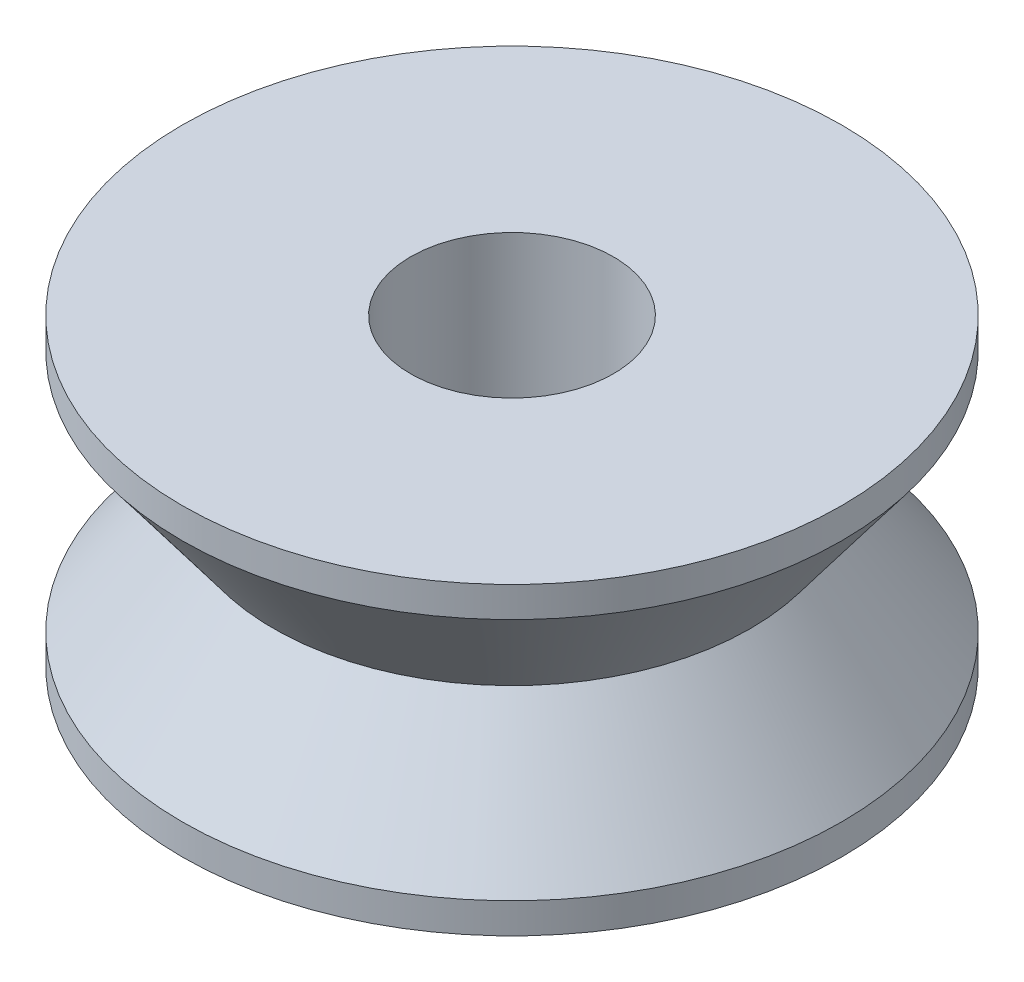
ISO-10303-21;
HEADER;
FILE_DESCRIPTION(('STEP AP214'),'2;1');
FILE_NAME('part.step','',(''),(''),'','','');
FILE_SCHEMA(('AUTOMOTIVE_DESIGN { 1 0 10303 214 1 1 1 1 }'));
ENDSEC;
DATA;
#1=APPLICATION_CONTEXT('core data for automotive mechanical design processes');
#2=APPLICATION_PROTOCOL_DEFINITION('international standard','automotive_design',2000,#1);
#3=PRODUCT_CONTEXT('',#1,'mechanical');
#4=PRODUCT('Part','Part','',(#3));
#5=PRODUCT_RELATED_PRODUCT_CATEGORY('part','',(#4));
#6=PRODUCT_DEFINITION_FORMATION('','',#4);
#7=PRODUCT_DEFINITION_CONTEXT('part definition',#1,'design');
#8=PRODUCT_DEFINITION('design','',#6,#7);
#9=PRODUCT_DEFINITION_SHAPE('','',#8);
#10=(LENGTH_UNIT() NAMED_UNIT(*) SI_UNIT(.MILLI.,.METRE.));
#11=(NAMED_UNIT(*) PLANE_ANGLE_UNIT() SI_UNIT($,.RADIAN.));
#12=(NAMED_UNIT(*) SI_UNIT($,.STERADIAN.) SOLID_ANGLE_UNIT());
#13=UNCERTAINTY_MEASURE_WITH_UNIT(LENGTH_MEASURE(1.E-05),#10,'distance_accuracy_value','');
#14=(GEOMETRIC_REPRESENTATION_CONTEXT(3) GLOBAL_UNCERTAINTY_ASSIGNED_CONTEXT((#13)) GLOBAL_UNIT_ASSIGNED_CONTEXT((#10,
#11,#12)) REPRESENTATION_CONTEXT('',''));
#15=CARTESIAN_POINT('',(0.,0.,0.));
#16=DIRECTION('',(0.,0.,1.));
#17=DIRECTION('',(1.,0.,0.));
#18=AXIS2_PLACEMENT_3D('',#15,#16,#17);
#19=CARTESIAN_POINT('',(0.,0.,0.));
#20=DIRECTION('',(0.,-1.,0.));
#21=DIRECTION('',(1.,0.,0.));
#22=AXIS2_PLACEMENT_3D('',#19,#20,#21);
#23=CONICAL_SURFACE('',#22,4.7,0.643501108793284);
#24=CARTESIAN_POINT('',(0.,-2.4,0.));
#25=DIRECTION('',(0.,-1.,0.));
#26=DIRECTION('',(1.,0.,0.));
#27=AXIS2_PLACEMENT_3D('',#24,#25,#26);
#28=CIRCLE('',#27,6.5);
#29=CARTESIAN_POINT('',(6.5,-2.4,0.));
#30=VERTEX_POINT('',#29);
#31=EDGE_CURVE('E52',#30,#30,#28,.T.);
#32=ORIENTED_EDGE('',*,*,#31,.F.);
#33=EDGE_LOOP('',(#32));
#34=FACE_BOUND('',#33,.T.);
#35=CARTESIAN_POINT('',(0.,0.,0.));
#36=DIRECTION('',(0.,-1.,0.));
#37=DIRECTION('',(1.,0.,0.));
#38=AXIS2_PLACEMENT_3D('',#35,#36,#37);
#39=CIRCLE('',#38,4.7);
#40=CARTESIAN_POINT('',(4.7,0.,0.));
#41=VERTEX_POINT('',#40);
#42=EDGE_CURVE('E10',#41,#41,#39,.T.);
#43=ORIENTED_EDGE('',*,*,#42,.T.);
#44=EDGE_LOOP('',(#43));
#45=FACE_BOUND('',#44,.T.);
#46=ADVANCED_FACE('F33',(#34,#45),#23,.T.);
#47=CARTESIAN_POINT('',(0.,2.4,0.));
#48=DIRECTION('',(0.,1.,0.));
#49=DIRECTION('',(-1.,0.,0.));
#50=AXIS2_PLACEMENT_3D('',#47,#48,#49);
#51=CONICAL_SURFACE('',#50,6.5,0.643501108793284);
#52=ORIENTED_EDGE('',*,*,#42,.F.);
#53=EDGE_LOOP('',(#52));
#54=FACE_BOUND('',#53,.T.);
#55=CARTESIAN_POINT('',(0.,2.4,0.));
#56=DIRECTION('',(0.,-1.,0.));
#57=DIRECTION('',(1.,0.,0.));
#58=AXIS2_PLACEMENT_3D('',#55,#56,#57);
#59=CIRCLE('',#58,6.5);
#60=CARTESIAN_POINT('',(6.5,2.4,0.));
#61=VERTEX_POINT('',#60);
#62=EDGE_CURVE('E40',#61,#61,#59,.T.);
#63=ORIENTED_EDGE('',*,*,#62,.T.);
#64=EDGE_LOOP('',(#63));
#65=FACE_BOUND('',#64,.T.);
#66=ADVANCED_FACE('F80',(#54,#65),#51,.T.);
#67=CARTESIAN_POINT('',(0.,-3.,0.));
#68=DIRECTION('',(0.,-1.,0.));
#69=DIRECTION('',(1.,0.,0.));
#70=AXIS2_PLACEMENT_3D('',#67,#68,#69);
#71=CYLINDRICAL_SURFACE('',#70,6.5);
#72=ORIENTED_EDGE('',*,*,#62,.F.);
#73=EDGE_LOOP('',(#72));
#74=FACE_BOUND('',#73,.T.);
#75=CARTESIAN_POINT('',(0.,3.,0.));
#76=DIRECTION('',(0.,-1.,0.));
#77=DIRECTION('',(1.,0.,0.));
#78=AXIS2_PLACEMENT_3D('',#75,#76,#77);
#79=CIRCLE('',#78,6.5);
#80=CARTESIAN_POINT('',(6.5,3.,0.));
#81=VERTEX_POINT('',#80);
#82=EDGE_CURVE('E44',#81,#81,#79,.T.);
#83=ORIENTED_EDGE('',*,*,#82,.T.);
#84=EDGE_LOOP('',(#83));
#85=FACE_BOUND('',#84,.T.);
#86=ADVANCED_FACE('F85',(#74,#85),#71,.T.);
#87=CARTESIAN_POINT('',(0.,3.,0.));
#88=DIRECTION('',(0.,-1.,0.));
#89=DIRECTION('',(1.,0.,0.));
#90=AXIS2_PLACEMENT_3D('',#87,#88,#89);
#91=PLANE('',#90);
#92=CARTESIAN_POINT('',(0.,3.,0.));
#93=DIRECTION('',(0.,1.,0.));
#94=DIRECTION('',(-1.,0.,0.));
#95=AXIS2_PLACEMENT_3D('',#92,#93,#94);
#96=CIRCLE('',#95,2.);
#97=CARTESIAN_POINT('',(-2.,3.,0.));
#98=VERTEX_POINT('',#97);
#99=EDGE_CURVE('E55',#98,#98,#96,.T.);
#100=ORIENTED_EDGE('',*,*,#99,.F.);
#101=EDGE_LOOP('',(#100));
#102=FACE_BOUND('',#101,.T.);
#103=ORIENTED_EDGE('',*,*,#82,.F.);
#104=EDGE_LOOP('',(#103));
#105=FACE_BOUND('',#104,.T.);
#106=ADVANCED_FACE('F68',(#102,#105),#91,.F.);
#107=CARTESIAN_POINT('',(0.,-3.,0.));
#108=DIRECTION('',(0.,-1.,0.));
#109=DIRECTION('',(1.,0.,0.));
#110=AXIS2_PLACEMENT_3D('',#107,#108,#109);
#111=PLANE('',#110);
#112=CARTESIAN_POINT('',(0.,-3.,0.));
#113=DIRECTION('',(0.,-1.,0.));
#114=DIRECTION('',(1.,0.,0.));
#115=AXIS2_PLACEMENT_3D('',#112,#113,#114);
#116=CIRCLE('',#115,2.);
#117=CARTESIAN_POINT('',(2.,-3.,0.));
#118=VERTEX_POINT('',#117);
#119=EDGE_CURVE('E36',#118,#118,#116,.T.);
#120=ORIENTED_EDGE('',*,*,#119,.F.);
#121=EDGE_LOOP('',(#120));
#122=FACE_BOUND('',#121,.T.);
#123=CARTESIAN_POINT('',(0.,-3.,0.));
#124=DIRECTION('',(0.,-1.,0.));
#125=DIRECTION('',(1.,0.,0.));
#126=AXIS2_PLACEMENT_3D('',#123,#124,#125);
#127=CIRCLE('',#126,6.5);
#128=CARTESIAN_POINT('',(6.5,-3.,0.));
#129=VERTEX_POINT('',#128);
#130=EDGE_CURVE('E49',#129,#129,#127,.T.);
#131=ORIENTED_EDGE('',*,*,#130,.T.);
#132=EDGE_LOOP('',(#131));
#133=FACE_BOUND('',#132,.T.);
#134=ADVANCED_FACE('F64',(#122,#133),#111,.T.);
#135=CARTESIAN_POINT('',(0.,-3.,0.));
#136=DIRECTION('',(0.,-1.,0.));
#137=DIRECTION('',(1.,0.,0.));
#138=AXIS2_PLACEMENT_3D('',#135,#136,#137);
#139=CYLINDRICAL_SURFACE('',#138,6.5);
#140=ORIENTED_EDGE('',*,*,#31,.T.);
#141=EDGE_LOOP('',(#140));
#142=FACE_BOUND('',#141,.T.);
#143=ORIENTED_EDGE('',*,*,#130,.F.);
#144=EDGE_LOOP('',(#143));
#145=FACE_BOUND('',#144,.T.);
#146=ADVANCED_FACE('F67',(#142,#145),#139,.T.);
#147=CARTESIAN_POINT('',(0.,-7.,0.));
#148=DIRECTION('',(0.,1.,0.));
#149=DIRECTION('',(-1.,0.,0.));
#150=AXIS2_PLACEMENT_3D('',#147,#148,#149);
#151=CYLINDRICAL_SURFACE('',#150,2.);
#152=ORIENTED_EDGE('',*,*,#119,.T.);
#153=EDGE_LOOP('',(#152));
#154=FACE_BOUND('',#153,.T.);
#155=ORIENTED_EDGE('',*,*,#99,.T.);
#156=EDGE_LOOP('',(#155));
#157=FACE_BOUND('',#156,.T.);
#158=ADVANCED_FACE('F62',(#154,#157),#151,.F.);
#159=CLOSED_SHELL('',(#46,#66,#86,#106,#134,#146,#158));
#160=MANIFOLD_SOLID_BREP('B2',#159);
#161=ADVANCED_BREP_SHAPE_REPRESENTATION('',(#18,#160),#14);
#162=SHAPE_DEFINITION_REPRESENTATION(#9,#161);
ENDSEC;
END-ISO-10303-21;
